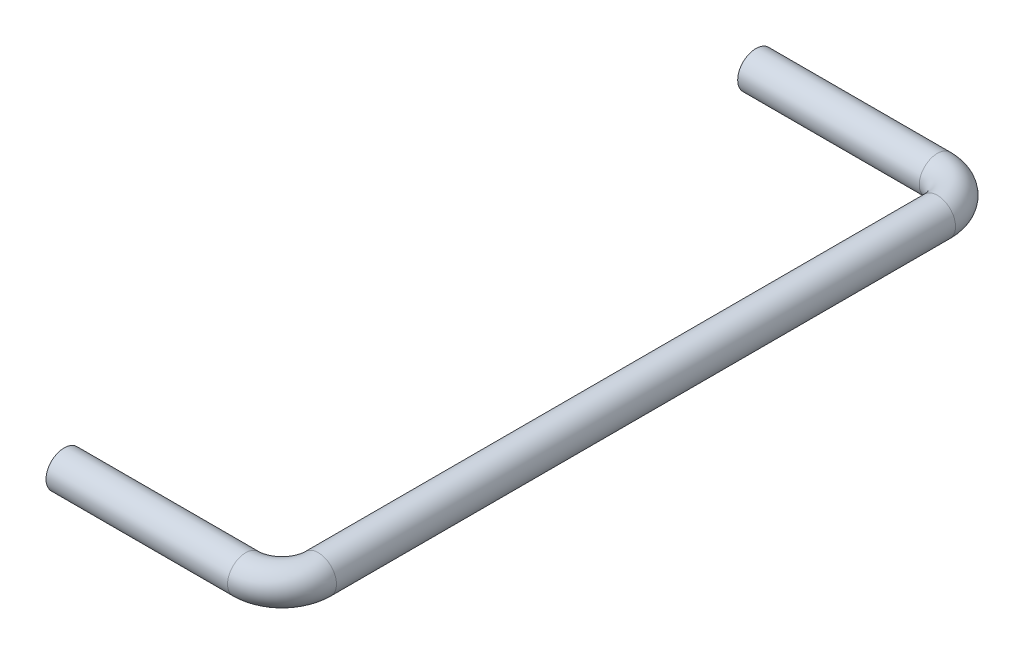
ISO-10303-21;
HEADER;
FILE_DESCRIPTION(('STEP AP214'),'2;1');
FILE_NAME('part.step','',(''),(''),'','','');
FILE_SCHEMA(('AUTOMOTIVE_DESIGN { 1 0 10303 214 1 1 1 1 }'));
ENDSEC;
DATA;
#1=APPLICATION_CONTEXT('core data for automotive mechanical design processes');
#2=APPLICATION_PROTOCOL_DEFINITION('international standard','automotive_design',2000,#1);
#3=PRODUCT_CONTEXT('',#1,'mechanical');
#4=PRODUCT('Part','Part','',(#3));
#5=PRODUCT_RELATED_PRODUCT_CATEGORY('part','',(#4));
#6=PRODUCT_DEFINITION_FORMATION('','',#4);
#7=PRODUCT_DEFINITION_CONTEXT('part definition',#1,'design');
#8=PRODUCT_DEFINITION('design','',#6,#7);
#9=PRODUCT_DEFINITION_SHAPE('','',#8);
#10=(LENGTH_UNIT() NAMED_UNIT(*) SI_UNIT(.MILLI.,.METRE.));
#11=(NAMED_UNIT(*) PLANE_ANGLE_UNIT() SI_UNIT($,.RADIAN.));
#12=(NAMED_UNIT(*) SI_UNIT($,.STERADIAN.) SOLID_ANGLE_UNIT());
#13=UNCERTAINTY_MEASURE_WITH_UNIT(LENGTH_MEASURE(1.E-05),#10,'distance_accuracy_value','');
#14=(GEOMETRIC_REPRESENTATION_CONTEXT(3) GLOBAL_UNCERTAINTY_ASSIGNED_CONTEXT((#13)) GLOBAL_UNIT_ASSIGNED_CONTEXT((#10,
#11,#12)) REPRESENTATION_CONTEXT('',''));
#15=CARTESIAN_POINT('',(0.,0.,0.));
#16=DIRECTION('',(0.,0.,1.));
#17=DIRECTION('',(1.,0.,0.));
#18=AXIS2_PLACEMENT_3D('',#15,#16,#17);
#19=CARTESIAN_POINT('',(3.7,0.,-6.82));
#20=DIRECTION('',(0.,1.,0.));
#21=DIRECTION('',(0.,0.,1.));
#22=AXIS2_PLACEMENT_3D('',#19,#20,#21);
#23=TOROIDAL_SURFACE('',#22,0.8,0.399999999999999);
#24=CARTESIAN_POINT('',(4.5,0.,-6.82));
#25=DIRECTION('',(0.,0.,1.));
#26=DIRECTION('',(1.,0.,0.));
#27=AXIS2_PLACEMENT_3D('',#24,#25,#26);
#28=CIRCLE('',#27,0.4);
#29=CARTESIAN_POINT('',(4.9,0.,-6.82));
#30=VERTEX_POINT('',#29);
#31=EDGE_CURVE('E53',#30,#30,#28,.T.);
#32=ORIENTED_EDGE('',*,*,#31,.F.);
#33=EDGE_LOOP('',(#32));
#34=FACE_BOUND('',#33,.T.);
#35=CARTESIAN_POINT('',(3.7,0.,-7.62));
#36=DIRECTION('',(-1.,0.,0.));
#37=DIRECTION('',(0.,0.,-1.));
#38=AXIS2_PLACEMENT_3D('',#35,#36,#37);
#39=CIRCLE('',#38,0.399999999999999);
#40=CARTESIAN_POINT('',(3.7,0.,-8.02));
#41=VERTEX_POINT('',#40);
#42=EDGE_CURVE('E107',#41,#41,#39,.F.);
#43=ORIENTED_EDGE('',*,*,#42,.T.);
#44=EDGE_LOOP('',(#43));
#45=FACE_BOUND('',#44,.T.);
#46=ADVANCED_FACE('F44',(#34,#45),#23,.T.);
#47=CARTESIAN_POINT('',(3.7,0.,6.82));
#48=DIRECTION('',(0.,-1.,0.));
#49=DIRECTION('',(0.,0.,-1.));
#50=AXIS2_PLACEMENT_3D('',#47,#48,#49);
#51=TOROIDAL_SURFACE('',#50,0.8,0.399999999999999);
#52=CARTESIAN_POINT('',(4.5,0.,6.82));
#53=DIRECTION('',(0.,0.,1.));
#54=DIRECTION('',(1.,0.,0.));
#55=AXIS2_PLACEMENT_3D('',#52,#53,#54);
#56=CIRCLE('',#55,0.4);
#57=CARTESIAN_POINT('',(4.9,0.,6.82));
#58=VERTEX_POINT('',#57);
#59=EDGE_CURVE('E11',#58,#58,#56,.F.);
#60=ORIENTED_EDGE('',*,*,#59,.F.);
#61=EDGE_LOOP('',(#60));
#62=FACE_BOUND('',#61,.T.);
#63=CARTESIAN_POINT('',(3.7,0.,7.62));
#64=DIRECTION('',(-1.,0.,0.));
#65=DIRECTION('',(0.,0.,1.));
#66=AXIS2_PLACEMENT_3D('',#63,#64,#65);
#67=CIRCLE('',#66,0.399999999999999);
#68=CARTESIAN_POINT('',(3.7,0.,8.02));
#69=VERTEX_POINT('',#68);
#70=EDGE_CURVE('E60',#69,#69,#67,.F.);
#71=ORIENTED_EDGE('',*,*,#70,.T.);
#72=EDGE_LOOP('',(#71));
#73=FACE_BOUND('',#72,.T.);
#74=ADVANCED_FACE('F77',(#62,#73),#51,.T.);
#75=CARTESIAN_POINT('',(4.5,0.,0.));
#76=DIRECTION('',(0.,0.,1.));
#77=DIRECTION('',(1.,0.,0.));
#78=AXIS2_PLACEMENT_3D('',#75,#76,#77);
#79=CYLINDRICAL_SURFACE('',#78,0.4);
#80=ORIENTED_EDGE('',*,*,#59,.T.);
#81=EDGE_LOOP('',(#80));
#82=FACE_BOUND('',#81,.T.);
#83=ORIENTED_EDGE('',*,*,#31,.T.);
#84=EDGE_LOOP('',(#83));
#85=FACE_BOUND('',#84,.T.);
#86=ADVANCED_FACE('F80',(#82,#85),#79,.T.);
#87=CARTESIAN_POINT('',(-0.299999999999987,0.,-7.61999999999999));
#88=DIRECTION('',(1.,0.,0.));
#89=DIRECTION('',(0.,0.,-1.));
#90=AXIS2_PLACEMENT_3D('',#87,#88,#89);
#91=CYLINDRICAL_SURFACE('',#90,0.399999999999999);
#92=CARTESIAN_POINT('',(-0.299999999999987,0.,-7.61999999999999));
#93=DIRECTION('',(-1.,0.,0.));
#94=DIRECTION('',(0.,0.,1.));
#95=AXIS2_PLACEMENT_3D('',#92,#93,#94);
#96=CIRCLE('',#95,0.399999999999999);
#97=CARTESIAN_POINT('',(-0.299999999999987,0.,-7.21999999999999));
#98=VERTEX_POINT('',#97);
#99=EDGE_CURVE('E64',#98,#98,#96,.T.);
#100=ORIENTED_EDGE('',*,*,#99,.F.);
#101=EDGE_LOOP('',(#100));
#102=FACE_BOUND('',#101,.T.);
#103=ORIENTED_EDGE('',*,*,#42,.F.);
#104=EDGE_LOOP('',(#103));
#105=FACE_BOUND('',#104,.T.);
#106=ADVANCED_FACE('F84',(#102,#105),#91,.T.);
#107=CARTESIAN_POINT('',(-0.299999999999987,0.,-7.61999999999999));
#108=DIRECTION('',(-1.,0.,0.));
#109=DIRECTION('',(0.,0.,1.));
#110=AXIS2_PLACEMENT_3D('',#107,#108,#109);
#111=PLANE('',#110);
#112=ORIENTED_EDGE('',*,*,#99,.T.);
#113=EDGE_LOOP('',(#112));
#114=FACE_BOUND('',#113,.T.);
#115=ADVANCED_FACE('F87',(#114),#111,.T.);
#116=CARTESIAN_POINT('',(-0.299999999999987,0.,7.61999999999999));
#117=DIRECTION('',(1.,0.,0.));
#118=DIRECTION('',(0.,0.,-1.));
#119=AXIS2_PLACEMENT_3D('',#116,#117,#118);
#120=CYLINDRICAL_SURFACE('',#119,0.399999999999999);
#121=CARTESIAN_POINT('',(-0.299999999999987,0.,7.61999999999999));
#122=DIRECTION('',(-1.,0.,0.));
#123=DIRECTION('',(0.,0.,1.));
#124=AXIS2_PLACEMENT_3D('',#121,#122,#123);
#125=CIRCLE('',#124,0.399999999999999);
#126=CARTESIAN_POINT('',(-0.299999999999988,0.,8.01999999999999));
#127=VERTEX_POINT('',#126);
#128=EDGE_CURVE('E103',#127,#127,#125,.T.);
#129=ORIENTED_EDGE('',*,*,#128,.F.);
#130=EDGE_LOOP('',(#129));
#131=FACE_BOUND('',#130,.T.);
#132=ORIENTED_EDGE('',*,*,#70,.F.);
#133=EDGE_LOOP('',(#132));
#134=FACE_BOUND('',#133,.T.);
#135=ADVANCED_FACE('F91',(#131,#134),#120,.T.);
#136=CARTESIAN_POINT('',(-0.299999999999987,0.,7.61999999999999));
#137=DIRECTION('',(-1.,0.,0.));
#138=DIRECTION('',(0.,0.,1.));
#139=AXIS2_PLACEMENT_3D('',#136,#137,#138);
#140=PLANE('',#139);
#141=ORIENTED_EDGE('',*,*,#128,.T.);
#142=EDGE_LOOP('',(#141));
#143=FACE_BOUND('',#142,.T.);
#144=ADVANCED_FACE('F95',(#143),#140,.T.);
#145=CLOSED_SHELL('',(#46,#74,#86,#106,#115,#135,#144));
#146=MANIFOLD_SOLID_BREP('B2',#145);
#147=ADVANCED_BREP_SHAPE_REPRESENTATION('',(#18,#146),#14);
#148=SHAPE_DEFINITION_REPRESENTATION(#9,#147);
ENDSEC;
END-ISO-10303-21;
